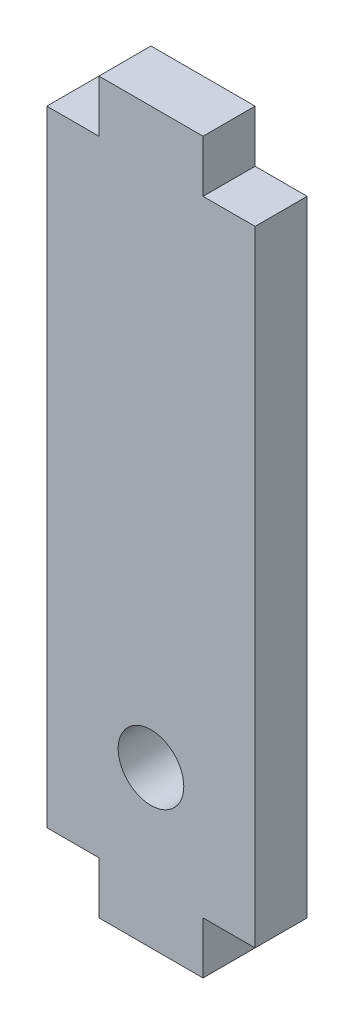
ISO-10303-21;
HEADER;
FILE_DESCRIPTION(('STEP AP214'),'2;1');
FILE_NAME('part.step','',(''),(''),'','','');
FILE_SCHEMA(('AUTOMOTIVE_DESIGN { 1 0 10303 214 1 1 1 1 }'));
ENDSEC;
DATA;
#1=APPLICATION_CONTEXT('core data for automotive mechanical design processes');
#2=APPLICATION_PROTOCOL_DEFINITION('international standard','automotive_design',2000,#1);
#3=PRODUCT_CONTEXT('',#1,'mechanical');
#4=PRODUCT('Part','Part','',(#3));
#5=PRODUCT_RELATED_PRODUCT_CATEGORY('part','',(#4));
#6=PRODUCT_DEFINITION_FORMATION('','',#4);
#7=PRODUCT_DEFINITION_CONTEXT('part definition',#1,'design');
#8=PRODUCT_DEFINITION('design','',#6,#7);
#9=PRODUCT_DEFINITION_SHAPE('','',#8);
#10=(LENGTH_UNIT() NAMED_UNIT(*) SI_UNIT(.MILLI.,.METRE.));
#11=(NAMED_UNIT(*) PLANE_ANGLE_UNIT() SI_UNIT($,.RADIAN.));
#12=(NAMED_UNIT(*) SI_UNIT($,.STERADIAN.) SOLID_ANGLE_UNIT());
#13=UNCERTAINTY_MEASURE_WITH_UNIT(LENGTH_MEASURE(1.E-05),#10,'distance_accuracy_value','');
#14=(GEOMETRIC_REPRESENTATION_CONTEXT(3) GLOBAL_UNCERTAINTY_ASSIGNED_CONTEXT((#13)) GLOBAL_UNIT_ASSIGNED_CONTEXT((#10,
#11,#12)) REPRESENTATION_CONTEXT('',''));
#15=CARTESIAN_POINT('',(0.,0.,0.));
#16=DIRECTION('',(0.,0.,1.));
#17=DIRECTION('',(1.,0.,0.));
#18=AXIS2_PLACEMENT_3D('',#15,#16,#17);
#19=CARTESIAN_POINT('',(12.7,0.,6.35));
#20=DIRECTION('',(-1.,0.,0.));
#21=DIRECTION('',(0.,0.,1.));
#22=AXIS2_PLACEMENT_3D('',#19,#20,#21);
#23=PLANE('',#22);
#24=DIRECTION('',(0.,1.,0.));
#25=VECTOR('',#24,1.);
#26=CARTESIAN_POINT('',(12.7,0.,0.));
#27=LINE('',#26,#25);
#28=CARTESIAN_POINT('',(12.7,-38.1,0.));
#29=VERTEX_POINT('',#28);
#30=CARTESIAN_POINT('',(12.7,38.1,0.));
#31=VERTEX_POINT('',#30);
#32=EDGE_CURVE('E209',#29,#31,#27,.T.);
#33=ORIENTED_EDGE('',*,*,#32,.T.);
#34=DIRECTION('',(0.,0.,-1.));
#35=VECTOR('',#34,1.);
#36=CARTESIAN_POINT('',(12.7,38.1,6.35));
#37=LINE('',#36,#35);
#38=CARTESIAN_POINT('',(12.7,38.1,6.35));
#39=VERTEX_POINT('',#38);
#40=EDGE_CURVE('E250',#39,#31,#37,.T.);
#41=ORIENTED_EDGE('',*,*,#40,.F.);
#42=DIRECTION('',(0.,1.,0.));
#43=VECTOR('',#42,1.);
#44=CARTESIAN_POINT('',(12.7,0.,6.35));
#45=LINE('',#44,#43);
#46=CARTESIAN_POINT('',(12.7,-38.1,6.35));
#47=VERTEX_POINT('',#46);
#48=EDGE_CURVE('E228',#47,#39,#45,.T.);
#49=ORIENTED_EDGE('',*,*,#48,.F.);
#50=DIRECTION('',(0.,0.,-1.));
#51=VECTOR('',#50,1.);
#52=CARTESIAN_POINT('',(12.7,-38.1,6.35));
#53=LINE('',#52,#51);
#54=EDGE_CURVE('E159',#47,#29,#53,.T.);
#55=ORIENTED_EDGE('',*,*,#54,.T.);
#56=EDGE_LOOP('',(#33,#41,#49,#55));
#57=FACE_BOUND('',#56,.T.);
#58=ADVANCED_FACE('F65',(#57),#23,.F.);
#59=CARTESIAN_POINT('',(-12.7,0.,6.35));
#60=DIRECTION('',(-1.,0.,0.));
#61=DIRECTION('',(0.,0.,1.));
#62=AXIS2_PLACEMENT_3D('',#59,#60,#61);
#63=PLANE('',#62);
#64=DIRECTION('',(0.,1.,0.));
#65=VECTOR('',#64,1.);
#66=CARTESIAN_POINT('',(-12.7,0.,0.));
#67=LINE('',#66,#65);
#68=CARTESIAN_POINT('',(-12.7,-38.1,0.));
#69=VERTEX_POINT('',#68);
#70=CARTESIAN_POINT('',(-12.7,38.1,0.));
#71=VERTEX_POINT('',#70);
#72=EDGE_CURVE('E218',#69,#71,#67,.T.);
#73=ORIENTED_EDGE('',*,*,#72,.F.);
#74=DIRECTION('',(0.,0.,-1.));
#75=VECTOR('',#74,1.);
#76=CARTESIAN_POINT('',(-12.7,-38.1,6.35));
#77=LINE('',#76,#75);
#78=CARTESIAN_POINT('',(-12.7,-38.1,6.35));
#79=VERTEX_POINT('',#78);
#80=EDGE_CURVE('E242',#79,#69,#77,.T.);
#81=ORIENTED_EDGE('',*,*,#80,.F.);
#82=DIRECTION('',(0.,1.,0.));
#83=VECTOR('',#82,1.);
#84=CARTESIAN_POINT('',(-12.7,0.,6.35));
#85=LINE('',#84,#83);
#86=CARTESIAN_POINT('',(-12.7,38.1,6.35));
#87=VERTEX_POINT('',#86);
#88=EDGE_CURVE('E239',#79,#87,#85,.T.);
#89=ORIENTED_EDGE('',*,*,#88,.T.);
#90=DIRECTION('',(0.,0.,-1.));
#91=VECTOR('',#90,1.);
#92=CARTESIAN_POINT('',(-12.7,38.1,6.35));
#93=LINE('',#92,#91);
#94=EDGE_CURVE('E246',#87,#71,#93,.T.);
#95=ORIENTED_EDGE('',*,*,#94,.T.);
#96=EDGE_LOOP('',(#73,#81,#89,#95));
#97=FACE_BOUND('',#96,.T.);
#98=ADVANCED_FACE('F333',(#97),#63,.T.);
#99=CARTESIAN_POINT('',(0.,0.,0.));
#100=DIRECTION('',(0.,0.,1.));
#101=DIRECTION('',(1.,0.,0.));
#102=AXIS2_PLACEMENT_3D('',#99,#100,#101);
#103=PLANE('',#102);
#104=CARTESIAN_POINT('',(0.,-25.4,0.));
#105=DIRECTION('',(0.,0.,1.));
#106=DIRECTION('',(1.,0.,0.));
#107=AXIS2_PLACEMENT_3D('',#104,#105,#106);
#108=CIRCLE('',#107,4.);
#109=CARTESIAN_POINT('',(4.,-25.4,0.));
#110=VERTEX_POINT('',#109);
#111=EDGE_CURVE('E139',#110,#110,#108,.T.);
#112=ORIENTED_EDGE('',*,*,#111,.T.);
#113=EDGE_LOOP('',(#112));
#114=FACE_BOUND('',#113,.T.);
#115=DIRECTION('',(1.,0.,0.));
#116=VECTOR('',#115,1.);
#117=CARTESIAN_POINT('',(0.,-38.1,0.));
#118=LINE('',#117,#116);
#119=CARTESIAN_POINT('',(-6.34999999999999,-38.1,0.));
#120=VERTEX_POINT('',#119);
#121=EDGE_CURVE('E205',#69,#120,#118,.T.);
#122=ORIENTED_EDGE('',*,*,#121,.F.);
#123=ORIENTED_EDGE('',*,*,#72,.T.);
#124=DIRECTION('',(1.,0.,0.));
#125=VECTOR('',#124,1.);
#126=CARTESIAN_POINT('',(0.,38.1,0.));
#127=LINE('',#126,#125);
#128=CARTESIAN_POINT('',(-6.34999999999999,38.1,0.));
#129=VERTEX_POINT('',#128);
#130=EDGE_CURVE('E145',#71,#129,#127,.T.);
#131=ORIENTED_EDGE('',*,*,#130,.T.);
#132=DIRECTION('',(0.,1.,0.));
#133=VECTOR('',#132,1.);
#134=CARTESIAN_POINT('',(-6.34999999999999,38.1,0.));
#135=LINE('',#134,#133);
#136=CARTESIAN_POINT('',(-6.34999999999999,44.45,0.));
#137=VERTEX_POINT('',#136);
#138=EDGE_CURVE('E125',#129,#137,#135,.T.);
#139=ORIENTED_EDGE('',*,*,#138,.T.);
#140=DIRECTION('',(1.,0.,0.));
#141=VECTOR('',#140,1.);
#142=CARTESIAN_POINT('',(-6.34999999999999,44.45,0.));
#143=LINE('',#142,#141);
#144=CARTESIAN_POINT('',(6.35000000000001,44.45,0.));
#145=VERTEX_POINT('',#144);
#146=EDGE_CURVE('E134',#137,#145,#143,.T.);
#147=ORIENTED_EDGE('',*,*,#146,.T.);
#148=DIRECTION('',(0.,1.,0.));
#149=VECTOR('',#148,1.);
#150=CARTESIAN_POINT('',(6.35000000000001,38.1,0.));
#151=LINE('',#150,#149);
#152=CARTESIAN_POINT('',(6.35000000000001,38.1,0.));
#153=VERTEX_POINT('',#152);
#154=EDGE_CURVE('E138',#153,#145,#151,.T.);
#155=ORIENTED_EDGE('',*,*,#154,.F.);
#156=EDGE_CURVE('E212',#153,#31,#127,.T.);
#157=ORIENTED_EDGE('',*,*,#156,.T.);
#158=ORIENTED_EDGE('',*,*,#32,.F.);
#159=CARTESIAN_POINT('',(6.35000000000001,-38.1,0.));
#160=VERTEX_POINT('',#159);
#161=EDGE_CURVE('E175',#160,#29,#118,.T.);
#162=ORIENTED_EDGE('',*,*,#161,.F.);
#163=DIRECTION('',(0.,-1.,0.));
#164=VECTOR('',#163,1.);
#165=CARTESIAN_POINT('',(6.35000000000001,-38.1,0.));
#166=LINE('',#165,#164);
#167=CARTESIAN_POINT('',(6.35000000000001,-44.45,0.));
#168=VERTEX_POINT('',#167);
#169=EDGE_CURVE('E185',#160,#168,#166,.T.);
#170=ORIENTED_EDGE('',*,*,#169,.T.);
#171=DIRECTION('',(1.,0.,0.));
#172=VECTOR('',#171,1.);
#173=CARTESIAN_POINT('',(-6.34999999999999,-44.45,0.));
#174=LINE('',#173,#172);
#175=CARTESIAN_POINT('',(-6.34999999999999,-44.45,0.));
#176=VERTEX_POINT('',#175);
#177=EDGE_CURVE('E131',#176,#168,#174,.T.);
#178=ORIENTED_EDGE('',*,*,#177,.F.);
#179=DIRECTION('',(0.,-1.,0.));
#180=VECTOR('',#179,1.);
#181=CARTESIAN_POINT('',(-6.34999999999999,-38.1,0.));
#182=LINE('',#181,#180);
#183=EDGE_CURVE('E189',#120,#176,#182,.T.);
#184=ORIENTED_EDGE('',*,*,#183,.F.);
#185=EDGE_LOOP('',(#122,#123,#131,#139,#147,#155,#157,#158,#162,#170,#178,#184));
#186=FACE_BOUND('',#185,.T.);
#187=ADVANCED_FACE('F142',(#114,#186),#103,.F.);
#188=CARTESIAN_POINT('',(0.,0.,6.35));
#189=DIRECTION('',(0.,0.,1.));
#190=DIRECTION('',(1.,0.,0.));
#191=AXIS2_PLACEMENT_3D('',#188,#189,#190);
#192=PLANE('',#191);
#193=CARTESIAN_POINT('',(0.,-25.4,6.35));
#194=DIRECTION('',(0.,0.,1.));
#195=DIRECTION('',(1.,0.,0.));
#196=AXIS2_PLACEMENT_3D('',#193,#194,#195);
#197=CIRCLE('',#196,4.);
#198=CARTESIAN_POINT('',(4.,-25.4,6.35));
#199=VERTEX_POINT('',#198);
#200=EDGE_CURVE('E261',#199,#199,#197,.T.);
#201=ORIENTED_EDGE('',*,*,#200,.F.);
#202=EDGE_LOOP('',(#201));
#203=FACE_BOUND('',#202,.T.);
#204=DIRECTION('',(1.,0.,0.));
#205=VECTOR('',#204,1.);
#206=CARTESIAN_POINT('',(0.,-38.1,6.35));
#207=LINE('',#206,#205);
#208=CARTESIAN_POINT('',(-6.34999999999999,-38.1,6.35));
#209=VERTEX_POINT('',#208);
#210=EDGE_CURVE('E224',#79,#209,#207,.T.);
#211=ORIENTED_EDGE('',*,*,#210,.T.);
#212=DIRECTION('',(0.,-1.,0.));
#213=VECTOR('',#212,1.);
#214=CARTESIAN_POINT('',(-6.34999999999999,-38.1,6.35));
#215=LINE('',#214,#213);
#216=CARTESIAN_POINT('',(-6.34999999999999,-44.45,6.35));
#217=VERTEX_POINT('',#216);
#218=EDGE_CURVE('E198',#209,#217,#215,.T.);
#219=ORIENTED_EDGE('',*,*,#218,.T.);
#220=DIRECTION('',(1.,0.,0.));
#221=VECTOR('',#220,1.);
#222=CARTESIAN_POINT('',(-6.34999999999999,-44.45,6.35));
#223=LINE('',#222,#221);
#224=CARTESIAN_POINT('',(6.35000000000001,-44.45,6.35));
#225=VERTEX_POINT('',#224);
#226=EDGE_CURVE('E192',#217,#225,#223,.T.);
#227=ORIENTED_EDGE('',*,*,#226,.T.);
#228=DIRECTION('',(0.,-1.,0.));
#229=VECTOR('',#228,1.);
#230=CARTESIAN_POINT('',(6.35000000000001,-38.1,6.35));
#231=LINE('',#230,#229);
#232=CARTESIAN_POINT('',(6.35000000000001,-38.1,6.35));
#233=VERTEX_POINT('',#232);
#234=EDGE_CURVE('E195',#233,#225,#231,.T.);
#235=ORIENTED_EDGE('',*,*,#234,.F.);
#236=EDGE_CURVE('E220',#233,#47,#207,.T.);
#237=ORIENTED_EDGE('',*,*,#236,.T.);
#238=ORIENTED_EDGE('',*,*,#48,.T.);
#239=DIRECTION('',(1.,0.,0.));
#240=VECTOR('',#239,1.);
#241=CARTESIAN_POINT('',(0.,38.1,6.35));
#242=LINE('',#241,#240);
#243=CARTESIAN_POINT('',(6.35000000000001,38.1,6.35));
#244=VERTEX_POINT('',#243);
#245=EDGE_CURVE('E231',#244,#39,#242,.T.);
#246=ORIENTED_EDGE('',*,*,#245,.F.);
#247=DIRECTION('',(0.,1.,0.));
#248=VECTOR('',#247,1.);
#249=CARTESIAN_POINT('',(6.35000000000001,38.1,6.35));
#250=LINE('',#249,#248);
#251=CARTESIAN_POINT('',(6.35000000000001,44.45,6.35));
#252=VERTEX_POINT('',#251);
#253=EDGE_CURVE('E151',#244,#252,#250,.T.);
#254=ORIENTED_EDGE('',*,*,#253,.T.);
#255=DIRECTION('',(1.,0.,0.));
#256=VECTOR('',#255,1.);
#257=CARTESIAN_POINT('',(-6.34999999999999,44.45,6.35));
#258=LINE('',#257,#256);
#259=CARTESIAN_POINT('',(-6.34999999999999,44.45,6.35));
#260=VERTEX_POINT('',#259);
#261=EDGE_CURVE('E147',#260,#252,#258,.T.);
#262=ORIENTED_EDGE('',*,*,#261,.F.);
#263=DIRECTION('',(0.,1.,0.));
#264=VECTOR('',#263,1.);
#265=CARTESIAN_POINT('',(-6.34999999999999,38.1,6.35));
#266=LINE('',#265,#264);
#267=CARTESIAN_POINT('',(-6.34999999999999,38.1,6.35));
#268=VERTEX_POINT('',#267);
#269=EDGE_CURVE('E128',#268,#260,#266,.T.);
#270=ORIENTED_EDGE('',*,*,#269,.F.);
#271=EDGE_CURVE('E235',#87,#268,#242,.T.);
#272=ORIENTED_EDGE('',*,*,#271,.F.);
#273=ORIENTED_EDGE('',*,*,#88,.F.);
#274=EDGE_LOOP('',(#211,#219,#227,#235,#237,#238,#246,#254,#262,#270,#272,#273));
#275=FACE_BOUND('',#274,.T.);
#276=ADVANCED_FACE('F277',(#203,#275),#192,.T.);
#277=CARTESIAN_POINT('',(0.,38.1,6.35));
#278=DIRECTION('',(0.,1.,0.));
#279=DIRECTION('',(0.,0.,1.));
#280=AXIS2_PLACEMENT_3D('',#277,#278,#279);
#281=PLANE('',#280);
#282=ORIENTED_EDGE('',*,*,#271,.T.);
#283=DIRECTION('',(0.,0.,-1.));
#284=VECTOR('',#283,1.);
#285=CARTESIAN_POINT('',(-6.34999999999999,38.1,6.35));
#286=LINE('',#285,#284);
#287=EDGE_CURVE('E155',#268,#129,#286,.T.);
#288=ORIENTED_EDGE('',*,*,#287,.T.);
#289=ORIENTED_EDGE('',*,*,#130,.F.);
#290=ORIENTED_EDGE('',*,*,#94,.F.);
#291=EDGE_LOOP('',(#282,#288,#289,#290));
#292=FACE_BOUND('',#291,.T.);
#293=ADVANCED_FACE('F280',(#292),#281,.T.);
#294=DIRECTION('',(0.,0.,-1.));
#295=VECTOR('',#294,1.);
#296=CARTESIAN_POINT('',(6.35000000000001,38.1,6.35));
#297=LINE('',#296,#295);
#298=EDGE_CURVE('E158',#244,#153,#297,.T.);
#299=ORIENTED_EDGE('',*,*,#298,.F.);
#300=ORIENTED_EDGE('',*,*,#245,.T.);
#301=ORIENTED_EDGE('',*,*,#40,.T.);
#302=ORIENTED_EDGE('',*,*,#156,.F.);
#303=EDGE_LOOP('',(#299,#300,#301,#302));
#304=FACE_BOUND('',#303,.T.);
#305=ADVANCED_FACE('F328',(#304),#281,.T.);
#306=CARTESIAN_POINT('',(0.,-38.1,6.35));
#307=DIRECTION('',(0.,1.,0.));
#308=DIRECTION('',(0.,0.,1.));
#309=AXIS2_PLACEMENT_3D('',#306,#307,#308);
#310=PLANE('',#309);
#311=ORIENTED_EDGE('',*,*,#236,.F.);
#312=DIRECTION('',(0.,0.,-1.));
#313=VECTOR('',#312,1.);
#314=CARTESIAN_POINT('',(6.35000000000001,-38.1,6.35));
#315=LINE('',#314,#313);
#316=EDGE_CURVE('E76',#233,#160,#315,.T.);
#317=ORIENTED_EDGE('',*,*,#316,.T.);
#318=ORIENTED_EDGE('',*,*,#161,.T.);
#319=ORIENTED_EDGE('',*,*,#54,.F.);
#320=EDGE_LOOP('',(#311,#317,#318,#319));
#321=FACE_BOUND('',#320,.T.);
#322=ADVANCED_FACE('F323',(#321),#310,.F.);
#323=DIRECTION('',(0.,0.,-1.));
#324=VECTOR('',#323,1.);
#325=CARTESIAN_POINT('',(-6.34999999999999,-38.1,6.35));
#326=LINE('',#325,#324);
#327=EDGE_CURVE('E12',#209,#120,#326,.T.);
#328=ORIENTED_EDGE('',*,*,#327,.F.);
#329=ORIENTED_EDGE('',*,*,#210,.F.);
#330=ORIENTED_EDGE('',*,*,#80,.T.);
#331=ORIENTED_EDGE('',*,*,#121,.T.);
#332=EDGE_LOOP('',(#328,#329,#330,#331));
#333=FACE_BOUND('',#332,.T.);
#334=ADVANCED_FACE('F289',(#333),#310,.F.);
#335=CARTESIAN_POINT('',(-6.34999999999999,44.45,6.35));
#336=DIRECTION('',(0.,1.,0.));
#337=DIRECTION('',(0.,0.,1.));
#338=AXIS2_PLACEMENT_3D('',#335,#336,#337);
#339=PLANE('',#338);
#340=ORIENTED_EDGE('',*,*,#146,.F.);
#341=DIRECTION('',(0.,0.,-1.));
#342=VECTOR('',#341,1.);
#343=CARTESIAN_POINT('',(-6.34999999999999,44.45,6.35));
#344=LINE('',#343,#342);
#345=EDGE_CURVE('E120',#260,#137,#344,.T.);
#346=ORIENTED_EDGE('',*,*,#345,.F.);
#347=ORIENTED_EDGE('',*,*,#261,.T.);
#348=DIRECTION('',(0.,0.,-1.));
#349=VECTOR('',#348,1.);
#350=CARTESIAN_POINT('',(6.35000000000001,44.45,6.35));
#351=LINE('',#350,#349);
#352=EDGE_CURVE('E69',#252,#145,#351,.T.);
#353=ORIENTED_EDGE('',*,*,#352,.T.);
#354=EDGE_LOOP('',(#340,#346,#347,#353));
#355=FACE_BOUND('',#354,.T.);
#356=ADVANCED_FACE('F67',(#355),#339,.T.);
#357=CARTESIAN_POINT('',(-6.34999999999999,38.1,6.35));
#358=DIRECTION('',(-1.,0.,0.));
#359=DIRECTION('',(0.,0.,1.));
#360=AXIS2_PLACEMENT_3D('',#357,#358,#359);
#361=PLANE('',#360);
#362=ORIENTED_EDGE('',*,*,#138,.F.);
#363=ORIENTED_EDGE('',*,*,#287,.F.);
#364=ORIENTED_EDGE('',*,*,#269,.T.);
#365=ORIENTED_EDGE('',*,*,#345,.T.);
#366=EDGE_LOOP('',(#362,#363,#364,#365));
#367=FACE_BOUND('',#366,.T.);
#368=ADVANCED_FACE('F121',(#367),#361,.T.);
#369=CARTESIAN_POINT('',(6.35000000000001,38.1,6.35));
#370=DIRECTION('',(-1.,0.,0.));
#371=DIRECTION('',(0.,0.,1.));
#372=AXIS2_PLACEMENT_3D('',#369,#370,#371);
#373=PLANE('',#372);
#374=ORIENTED_EDGE('',*,*,#154,.T.);
#375=ORIENTED_EDGE('',*,*,#352,.F.);
#376=ORIENTED_EDGE('',*,*,#253,.F.);
#377=ORIENTED_EDGE('',*,*,#298,.T.);
#378=EDGE_LOOP('',(#374,#375,#376,#377));
#379=FACE_BOUND('',#378,.T.);
#380=ADVANCED_FACE('F331',(#379),#373,.F.);
#381=CARTESIAN_POINT('',(-6.34999999999999,-44.45,6.35));
#382=DIRECTION('',(0.,1.,0.));
#383=DIRECTION('',(0.,0.,1.));
#384=AXIS2_PLACEMENT_3D('',#381,#382,#383);
#385=PLANE('',#384);
#386=ORIENTED_EDGE('',*,*,#177,.T.);
#387=DIRECTION('',(0.,0.,-1.));
#388=VECTOR('',#387,1.);
#389=CARTESIAN_POINT('',(6.35000000000001,-44.45,6.35));
#390=LINE('',#389,#388);
#391=EDGE_CURVE('E173',#225,#168,#390,.T.);
#392=ORIENTED_EDGE('',*,*,#391,.F.);
#393=ORIENTED_EDGE('',*,*,#226,.F.);
#394=DIRECTION('',(0.,0.,-1.));
#395=VECTOR('',#394,1.);
#396=CARTESIAN_POINT('',(-6.34999999999999,-44.45,6.35));
#397=LINE('',#396,#395);
#398=EDGE_CURVE('E176',#217,#176,#397,.T.);
#399=ORIENTED_EDGE('',*,*,#398,.T.);
#400=EDGE_LOOP('',(#386,#392,#393,#399));
#401=FACE_BOUND('',#400,.T.);
#402=ADVANCED_FACE('F321',(#401),#385,.F.);
#403=CARTESIAN_POINT('',(6.35000000000001,-38.1,6.35));
#404=DIRECTION('',(1.,0.,0.));
#405=DIRECTION('',(0.,1.,0.));
#406=AXIS2_PLACEMENT_3D('',#403,#404,#405);
#407=PLANE('',#406);
#408=ORIENTED_EDGE('',*,*,#169,.F.);
#409=ORIENTED_EDGE('',*,*,#316,.F.);
#410=ORIENTED_EDGE('',*,*,#234,.T.);
#411=ORIENTED_EDGE('',*,*,#391,.T.);
#412=EDGE_LOOP('',(#408,#409,#410,#411));
#413=FACE_BOUND('',#412,.T.);
#414=ADVANCED_FACE('F349',(#413),#407,.T.);
#415=CARTESIAN_POINT('',(-6.34999999999999,-38.1,6.35));
#416=DIRECTION('',(1.,0.,0.));
#417=DIRECTION('',(0.,1.,0.));
#418=AXIS2_PLACEMENT_3D('',#415,#416,#417);
#419=PLANE('',#418);
#420=ORIENTED_EDGE('',*,*,#183,.T.);
#421=ORIENTED_EDGE('',*,*,#398,.F.);
#422=ORIENTED_EDGE('',*,*,#218,.F.);
#423=ORIENTED_EDGE('',*,*,#327,.T.);
#424=EDGE_LOOP('',(#420,#421,#422,#423));
#425=FACE_BOUND('',#424,.T.);
#426=ADVANCED_FACE('F273',(#425),#419,.F.);
#427=CARTESIAN_POINT('',(0.,-25.4,0.));
#428=DIRECTION('',(0.,0.,1.));
#429=DIRECTION('',(1.,0.,0.));
#430=AXIS2_PLACEMENT_3D('',#427,#428,#429);
#431=CYLINDRICAL_SURFACE('',#430,4.);
#432=ORIENTED_EDGE('',*,*,#111,.F.);
#433=EDGE_LOOP('',(#432));
#434=FACE_BOUND('',#433,.T.);
#435=ORIENTED_EDGE('',*,*,#200,.T.);
#436=EDGE_LOOP('',(#435));
#437=FACE_BOUND('',#436,.T.);
#438=ADVANCED_FACE('F270',(#434,#437),#431,.F.);
#439=CLOSED_SHELL('',(#58,#98,#187,#276,#293,#305,#322,#334,#356,#368,#380,#402,#414,#426,#438));
#440=MANIFOLD_SOLID_BREP('B2',#439);
#441=ADVANCED_BREP_SHAPE_REPRESENTATION('',(#18,#440),#14);
#442=SHAPE_DEFINITION_REPRESENTATION(#9,#441);
ENDSEC;
END-ISO-10303-21;
